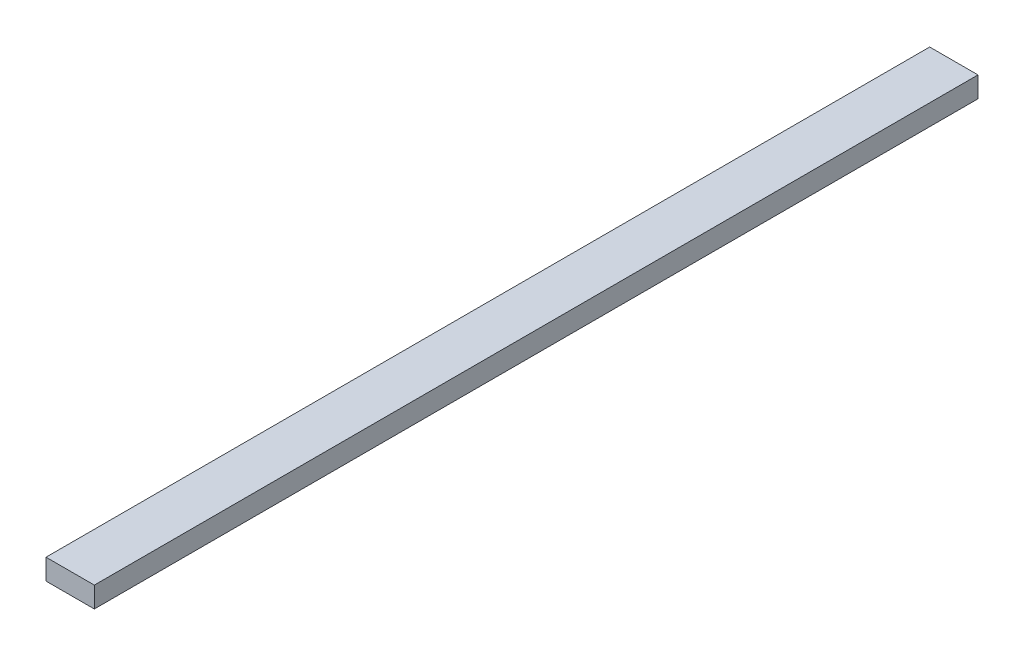
ISO-10303-21;
HEADER;
FILE_DESCRIPTION(('STEP AP214'),'2;1');
FILE_NAME('part.step','',(''),(''),'','','');
FILE_SCHEMA(('AUTOMOTIVE_DESIGN { 1 0 10303 214 1 1 1 1 }'));
ENDSEC;
DATA;
#1=APPLICATION_CONTEXT('core data for automotive mechanical design processes');
#2=APPLICATION_PROTOCOL_DEFINITION('international standard','automotive_design',2000,#1);
#3=PRODUCT_CONTEXT('',#1,'mechanical');
#4=PRODUCT('Part','Part','',(#3));
#5=PRODUCT_RELATED_PRODUCT_CATEGORY('part','',(#4));
#6=PRODUCT_DEFINITION_FORMATION('','',#4);
#7=PRODUCT_DEFINITION_CONTEXT('part definition',#1,'design');
#8=PRODUCT_DEFINITION('design','',#6,#7);
#9=PRODUCT_DEFINITION_SHAPE('','',#8);
#10=(LENGTH_UNIT() NAMED_UNIT(*) SI_UNIT(.MILLI.,.METRE.));
#11=(NAMED_UNIT(*) PLANE_ANGLE_UNIT() SI_UNIT($,.RADIAN.));
#12=(NAMED_UNIT(*) SI_UNIT($,.STERADIAN.) SOLID_ANGLE_UNIT());
#13=UNCERTAINTY_MEASURE_WITH_UNIT(LENGTH_MEASURE(1.E-05),#10,'distance_accuracy_value','');
#14=(GEOMETRIC_REPRESENTATION_CONTEXT(3) GLOBAL_UNCERTAINTY_ASSIGNED_CONTEXT((#13)) GLOBAL_UNIT_ASSIGNED_CONTEXT((#10,
#11,#12)) REPRESENTATION_CONTEXT('',''));
#15=CARTESIAN_POINT('',(0.,0.,0.));
#16=DIRECTION('',(0.,0.,1.));
#17=DIRECTION('',(1.,0.,0.));
#18=AXIS2_PLACEMENT_3D('',#15,#16,#17);
#19=CARTESIAN_POINT('',(0.,0.,1625.6));
#20=DIRECTION('',(1.,0.,0.));
#21=DIRECTION('',(0.,1.,0.));
#22=AXIS2_PLACEMENT_3D('',#19,#20,#21);
#23=PLANE('',#22);
#24=DIRECTION('',(0.,-1.,0.));
#25=VECTOR('',#24,1.);
#26=CARTESIAN_POINT('',(0.,0.,0.));
#27=LINE('',#26,#25);
#28=CARTESIAN_POINT('',(0.,0.,0.));
#29=VERTEX_POINT('',#28);
#30=CARTESIAN_POINT('',(0.,-38.1,0.));
#31=VERTEX_POINT('',#30);
#32=EDGE_CURVE('E96',#29,#31,#27,.T.);
#33=ORIENTED_EDGE('',*,*,#32,.T.);
#34=DIRECTION('',(0.,0.,-1.));
#35=VECTOR('',#34,1.);
#36=CARTESIAN_POINT('',(0.,-38.1,1625.6));
#37=LINE('',#36,#35);
#38=CARTESIAN_POINT('',(0.,-38.1,1625.6));
#39=VERTEX_POINT('',#38);
#40=EDGE_CURVE('E11',#39,#31,#37,.T.);
#41=ORIENTED_EDGE('',*,*,#40,.F.);
#42=DIRECTION('',(0.,-1.,0.));
#43=VECTOR('',#42,1.);
#44=CARTESIAN_POINT('',(0.,0.,1625.6));
#45=LINE('',#44,#43);
#46=CARTESIAN_POINT('',(0.,0.,1625.6));
#47=VERTEX_POINT('',#46);
#48=EDGE_CURVE('E84',#47,#39,#45,.T.);
#49=ORIENTED_EDGE('',*,*,#48,.F.);
#50=DIRECTION('',(0.,0.,-1.));
#51=VECTOR('',#50,1.);
#52=CARTESIAN_POINT('',(0.,0.,1625.6));
#53=LINE('',#52,#51);
#54=EDGE_CURVE('E92',#47,#29,#53,.T.);
#55=ORIENTED_EDGE('',*,*,#54,.T.);
#56=EDGE_LOOP('',(#33,#41,#49,#55));
#57=FACE_BOUND('',#56,.T.);
#58=ADVANCED_FACE('F33',(#57),#23,.F.);
#59=CARTESIAN_POINT('',(0.,-38.1,1625.6));
#60=DIRECTION('',(0.,1.,0.));
#61=DIRECTION('',(0.,0.,1.));
#62=AXIS2_PLACEMENT_3D('',#59,#60,#61);
#63=PLANE('',#62);
#64=DIRECTION('',(1.,0.,0.));
#65=VECTOR('',#64,1.);
#66=CARTESIAN_POINT('',(0.,-38.1,0.));
#67=LINE('',#66,#65);
#68=CARTESIAN_POINT('',(88.9,-38.1,0.));
#69=VERTEX_POINT('',#68);
#70=EDGE_CURVE('E88',#31,#69,#67,.T.);
#71=ORIENTED_EDGE('',*,*,#70,.T.);
#72=DIRECTION('',(0.,0.,-1.));
#73=VECTOR('',#72,1.);
#74=CARTESIAN_POINT('',(88.9,-38.1,1625.6));
#75=LINE('',#74,#73);
#76=CARTESIAN_POINT('',(88.9,-38.1,1625.6));
#77=VERTEX_POINT('',#76);
#78=EDGE_CURVE('E41',#77,#69,#75,.T.);
#79=ORIENTED_EDGE('',*,*,#78,.F.);
#80=DIRECTION('',(1.,0.,0.));
#81=VECTOR('',#80,1.);
#82=CARTESIAN_POINT('',(0.,-38.1,1625.6));
#83=LINE('',#82,#81);
#84=EDGE_CURVE('E79',#39,#77,#83,.T.);
#85=ORIENTED_EDGE('',*,*,#84,.F.);
#86=ORIENTED_EDGE('',*,*,#40,.T.);
#87=EDGE_LOOP('',(#71,#79,#85,#86));
#88=FACE_BOUND('',#87,.T.);
#89=ADVANCED_FACE('F87',(#88),#63,.F.);
#90=CARTESIAN_POINT('',(88.9,0.,1625.6));
#91=DIRECTION('',(-1.,0.,0.));
#92=DIRECTION('',(0.,0.,1.));
#93=AXIS2_PLACEMENT_3D('',#90,#91,#92);
#94=PLANE('',#93);
#95=DIRECTION('',(0.,1.,0.));
#96=VECTOR('',#95,1.);
#97=CARTESIAN_POINT('',(88.9,0.,0.));
#98=LINE('',#97,#96);
#99=CARTESIAN_POINT('',(88.9,0.,0.));
#100=VERTEX_POINT('',#99);
#101=EDGE_CURVE('E66',#69,#100,#98,.T.);
#102=ORIENTED_EDGE('',*,*,#101,.T.);
#103=DIRECTION('',(0.,0.,-1.));
#104=VECTOR('',#103,1.);
#105=CARTESIAN_POINT('',(88.9,0.,1625.6));
#106=LINE('',#105,#104);
#107=CARTESIAN_POINT('',(88.9,0.,1625.6));
#108=VERTEX_POINT('',#107);
#109=EDGE_CURVE('E89',#108,#100,#106,.T.);
#110=ORIENTED_EDGE('',*,*,#109,.F.);
#111=DIRECTION('',(0.,1.,0.));
#112=VECTOR('',#111,1.);
#113=CARTESIAN_POINT('',(88.9,0.,1625.6));
#114=LINE('',#113,#112);
#115=EDGE_CURVE('E82',#77,#108,#114,.T.);
#116=ORIENTED_EDGE('',*,*,#115,.F.);
#117=ORIENTED_EDGE('',*,*,#78,.T.);
#118=EDGE_LOOP('',(#102,#110,#116,#117));
#119=FACE_BOUND('',#118,.T.);
#120=ADVANCED_FACE('F90',(#119),#94,.F.);
#121=CARTESIAN_POINT('',(0.,0.,1625.6));
#122=DIRECTION('',(0.,-1.,0.));
#123=DIRECTION('',(0.,0.,-1.));
#124=AXIS2_PLACEMENT_3D('',#121,#122,#123);
#125=PLANE('',#124);
#126=DIRECTION('',(-1.,0.,0.));
#127=VECTOR('',#126,1.);
#128=CARTESIAN_POINT('',(0.,0.,0.));
#129=LINE('',#128,#127);
#130=EDGE_CURVE('E72',#100,#29,#129,.T.);
#131=ORIENTED_EDGE('',*,*,#130,.T.);
#132=ORIENTED_EDGE('',*,*,#54,.F.);
#133=DIRECTION('',(-1.,0.,0.));
#134=VECTOR('',#133,1.);
#135=CARTESIAN_POINT('',(0.,0.,1625.6));
#136=LINE('',#135,#134);
#137=EDGE_CURVE('E49',#108,#47,#136,.T.);
#138=ORIENTED_EDGE('',*,*,#137,.F.);
#139=ORIENTED_EDGE('',*,*,#109,.T.);
#140=EDGE_LOOP('',(#131,#132,#138,#139));
#141=FACE_BOUND('',#140,.T.);
#142=ADVANCED_FACE('F103',(#141),#125,.F.);
#143=CARTESIAN_POINT('',(0.,0.,1625.6));
#144=DIRECTION('',(0.,0.,1.));
#145=DIRECTION('',(1.,0.,0.));
#146=AXIS2_PLACEMENT_3D('',#143,#144,#145);
#147=PLANE('',#146);
#148=ORIENTED_EDGE('',*,*,#48,.T.);
#149=ORIENTED_EDGE('',*,*,#84,.T.);
#150=ORIENTED_EDGE('',*,*,#115,.T.);
#151=ORIENTED_EDGE('',*,*,#137,.T.);
#152=EDGE_LOOP('',(#148,#149,#150,#151));
#153=FACE_BOUND('',#152,.T.);
#154=ADVANCED_FACE('F80',(#153),#147,.T.);
#155=CARTESIAN_POINT('',(0.,0.,0.));
#156=DIRECTION('',(0.,0.,1.));
#157=DIRECTION('',(1.,0.,0.));
#158=AXIS2_PLACEMENT_3D('',#155,#156,#157);
#159=PLANE('',#158);
#160=ORIENTED_EDGE('',*,*,#32,.F.);
#161=ORIENTED_EDGE('',*,*,#130,.F.);
#162=ORIENTED_EDGE('',*,*,#101,.F.);
#163=ORIENTED_EDGE('',*,*,#70,.F.);
#164=EDGE_LOOP('',(#160,#161,#162,#163));
#165=FACE_BOUND('',#164,.T.);
#166=ADVANCED_FACE('F106',(#165),#159,.F.);
#167=CLOSED_SHELL('',(#58,#89,#120,#142,#154,#166));
#168=MANIFOLD_SOLID_BREP('B2',#167);
#169=ADVANCED_BREP_SHAPE_REPRESENTATION('',(#18,#168),#14);
#170=SHAPE_DEFINITION_REPRESENTATION(#9,#169);
ENDSEC;
END-ISO-10303-21;
